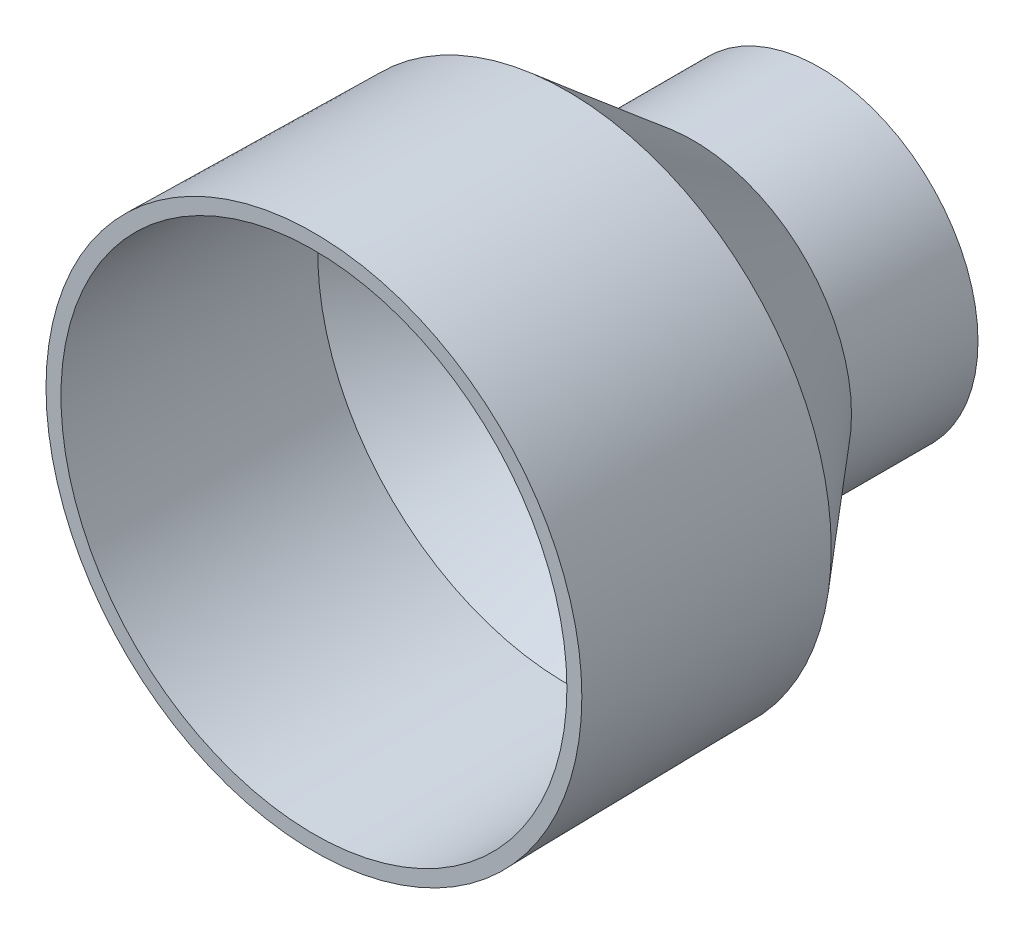
ISO-10303-21;
HEADER;
FILE_DESCRIPTION(('STEP AP214'),'2;1');
FILE_NAME('part.step','',(''),(''),'','','');
FILE_SCHEMA(('AUTOMOTIVE_DESIGN { 1 0 10303 214 1 1 1 1 }'));
ENDSEC;
DATA;
#1=APPLICATION_CONTEXT('core data for automotive mechanical design processes');
#2=APPLICATION_PROTOCOL_DEFINITION('international standard','automotive_design',2000,#1);
#3=PRODUCT_CONTEXT('',#1,'mechanical');
#4=PRODUCT('Part','Part','',(#3));
#5=PRODUCT_RELATED_PRODUCT_CATEGORY('part','',(#4));
#6=PRODUCT_DEFINITION_FORMATION('','',#4);
#7=PRODUCT_DEFINITION_CONTEXT('part definition',#1,'design');
#8=PRODUCT_DEFINITION('design','',#6,#7);
#9=PRODUCT_DEFINITION_SHAPE('','',#8);
#10=(LENGTH_UNIT() NAMED_UNIT(*) SI_UNIT(.MILLI.,.METRE.));
#11=(NAMED_UNIT(*) PLANE_ANGLE_UNIT() SI_UNIT($,.RADIAN.));
#12=(NAMED_UNIT(*) SI_UNIT($,.STERADIAN.) SOLID_ANGLE_UNIT());
#13=UNCERTAINTY_MEASURE_WITH_UNIT(LENGTH_MEASURE(1.E-05),#10,'distance_accuracy_value','');
#14=(GEOMETRIC_REPRESENTATION_CONTEXT(3) GLOBAL_UNCERTAINTY_ASSIGNED_CONTEXT((#13)) GLOBAL_UNIT_ASSIGNED_CONTEXT((#10,
#11,#12)) REPRESENTATION_CONTEXT('',''));
#15=CARTESIAN_POINT('',(0.,0.,0.));
#16=DIRECTION('',(0.,0.,1.));
#17=DIRECTION('',(1.,0.,0.));
#18=AXIS2_PLACEMENT_3D('',#15,#16,#17);
#19=CARTESIAN_POINT('',(0.,50.8,0.));
#20=DIRECTION('',(0.,0.,-1.));
#21=DIRECTION('',(-1.,0.,0.));
#22=AXIS2_PLACEMENT_3D('',#19,#20,#21);
#23=PLANE('',#22);
#24=CARTESIAN_POINT('',(0.,0.,0.));
#25=DIRECTION('',(0.,0.,1.));
#26=DIRECTION('',(1.,0.,0.));
#27=AXIS2_PLACEMENT_3D('',#24,#25,#26);
#28=CIRCLE('',#27,50.8);
#29=CARTESIAN_POINT('',(50.8,0.,0.));
#30=VERTEX_POINT('',#29);
#31=EDGE_CURVE('E10',#30,#30,#28,.T.);
#32=ORIENTED_EDGE('',*,*,#31,.F.);
#33=EDGE_LOOP('',(#32));
#34=FACE_BOUND('',#33,.T.);
#35=CARTESIAN_POINT('',(0.,0.,0.));
#36=DIRECTION('',(0.,0.,1.));
#37=DIRECTION('',(1.,0.,0.));
#38=AXIS2_PLACEMENT_3D('',#35,#36,#37);
#39=CIRCLE('',#38,53.8003374810178);
#40=CARTESIAN_POINT('',(53.8003374810178,0.,0.));
#41=VERTEX_POINT('',#40);
#42=EDGE_CURVE('E59',#41,#41,#39,.T.);
#43=ORIENTED_EDGE('',*,*,#42,.T.);
#44=EDGE_LOOP('',(#43));
#45=FACE_BOUND('',#44,.T.);
#46=ADVANCED_FACE('F31',(#34,#45),#23,.F.);
#47=CARTESIAN_POINT('',(0.,0.,0.));
#48=DIRECTION('',(0.,0.,1.));
#49=DIRECTION('',(1.,0.,0.));
#50=AXIS2_PLACEMENT_3D('',#47,#48,#49);
#51=CONICAL_SURFACE('',#50,50.8,0.0149988751518506);
#52=CARTESIAN_POINT('',(0.,0.,-50.8));
#53=DIRECTION('',(0.,0.,1.));
#54=DIRECTION('',(1.,0.,0.));
#55=AXIS2_PLACEMENT_3D('',#52,#53,#54);
#56=CIRCLE('',#55,50.038);
#57=CARTESIAN_POINT('',(50.038,0.,-50.8));
#58=VERTEX_POINT('',#57);
#59=EDGE_CURVE('E37',#58,#58,#56,.T.);
#60=ORIENTED_EDGE('',*,*,#59,.F.);
#61=EDGE_LOOP('',(#60));
#62=FACE_BOUND('',#61,.T.);
#63=ORIENTED_EDGE('',*,*,#31,.T.);
#64=EDGE_LOOP('',(#63));
#65=FACE_BOUND('',#64,.T.);
#66=ADVANCED_FACE('F96',(#62,#65),#51,.F.);
#67=CARTESIAN_POINT('',(0.,0.,-50.8));
#68=DIRECTION('',(0.,0.,1.));
#69=DIRECTION('',(1.,0.,0.));
#70=AXIS2_PLACEMENT_3D('',#67,#68,#69);
#71=CONICAL_SURFACE('',#70,50.038,0.701584135019358);
#72=CARTESIAN_POINT('',(0.,0.,-76.2));
#73=DIRECTION('',(0.,0.,1.));
#74=DIRECTION('',(1.,0.,0.));
#75=AXIS2_PLACEMENT_3D('',#72,#73,#74);
#76=CIRCLE('',#75,28.575);
#77=CARTESIAN_POINT('',(28.575,0.,-76.2));
#78=VERTEX_POINT('',#77);
#79=EDGE_CURVE('E41',#78,#78,#76,.T.);
#80=ORIENTED_EDGE('',*,*,#79,.F.);
#81=EDGE_LOOP('',(#80));
#82=FACE_BOUND('',#81,.T.);
#83=ORIENTED_EDGE('',*,*,#59,.T.);
#84=EDGE_LOOP('',(#83));
#85=FACE_BOUND('',#84,.T.);
#86=ADVANCED_FACE('F91',(#82,#85),#71,.F.);
#87=CARTESIAN_POINT('',(0.,0.,0.));
#88=DIRECTION('',(0.,0.,1.));
#89=DIRECTION('',(1.,0.,0.));
#90=AXIS2_PLACEMENT_3D('',#87,#88,#89);
#91=CYLINDRICAL_SURFACE('',#90,28.575);
#92=CARTESIAN_POINT('',(0.,0.,-101.6));
#93=DIRECTION('',(0.,0.,1.));
#94=DIRECTION('',(1.,0.,0.));
#95=AXIS2_PLACEMENT_3D('',#92,#93,#94);
#96=CIRCLE('',#95,28.575);
#97=CARTESIAN_POINT('',(28.575,0.,-101.6));
#98=VERTEX_POINT('',#97);
#99=EDGE_CURVE('E45',#98,#98,#96,.T.);
#100=ORIENTED_EDGE('',*,*,#99,.F.);
#101=EDGE_LOOP('',(#100));
#102=FACE_BOUND('',#101,.T.);
#103=ORIENTED_EDGE('',*,*,#79,.T.);
#104=EDGE_LOOP('',(#103));
#105=FACE_BOUND('',#104,.T.);
#106=ADVANCED_FACE('F85',(#102,#105),#91,.F.);
#107=CARTESIAN_POINT('',(0.,31.75,-101.6));
#108=DIRECTION('',(0.,0.,1.));
#109=DIRECTION('',(1.,0.,0.));
#110=AXIS2_PLACEMENT_3D('',#107,#108,#109);
#111=PLANE('',#110);
#112=CARTESIAN_POINT('',(0.,0.,-101.6));
#113=DIRECTION('',(0.,0.,1.));
#114=DIRECTION('',(1.,0.,0.));
#115=AXIS2_PLACEMENT_3D('',#112,#113,#114);
#116=CIRCLE('',#115,31.75);
#117=CARTESIAN_POINT('',(31.75,0.,-101.6));
#118=VERTEX_POINT('',#117);
#119=EDGE_CURVE('E50',#118,#118,#116,.T.);
#120=ORIENTED_EDGE('',*,*,#119,.F.);
#121=EDGE_LOOP('',(#120));
#122=FACE_BOUND('',#121,.T.);
#123=ORIENTED_EDGE('',*,*,#99,.T.);
#124=EDGE_LOOP('',(#123));
#125=FACE_BOUND('',#124,.T.);
#126=ADVANCED_FACE('F79',(#122,#125),#111,.F.);
#127=CARTESIAN_POINT('',(0.,0.,0.));
#128=DIRECTION('',(0.,0.,1.));
#129=DIRECTION('',(1.,0.,0.));
#130=AXIS2_PLACEMENT_3D('',#127,#128,#129);
#131=CYLINDRICAL_SURFACE('',#130,31.75);
#132=CARTESIAN_POINT('',(0.,0.,-76.2));
#133=DIRECTION('',(0.,0.,1.));
#134=DIRECTION('',(1.,0.,0.));
#135=AXIS2_PLACEMENT_3D('',#132,#133,#134);
#136=CIRCLE('',#135,31.75);
#137=CARTESIAN_POINT('',(31.75,0.,-76.2));
#138=VERTEX_POINT('',#137);
#139=EDGE_CURVE('E53',#138,#138,#136,.T.);
#140=ORIENTED_EDGE('',*,*,#139,.F.);
#141=EDGE_LOOP('',(#140));
#142=FACE_BOUND('',#141,.T.);
#143=ORIENTED_EDGE('',*,*,#119,.T.);
#144=EDGE_LOOP('',(#143));
#145=FACE_BOUND('',#144,.T.);
#146=ADVANCED_FACE('F73',(#142,#145),#131,.T.);
#147=CARTESIAN_POINT('',(0.,0.,-76.2));
#148=DIRECTION('',(0.,0.,1.));
#149=DIRECTION('',(1.,0.,0.));
#150=AXIS2_PLACEMENT_3D('',#147,#148,#149);
#151=CONICAL_SURFACE('',#150,31.75,0.698416010811808);
#152=CARTESIAN_POINT('',(0.,0.,-50.8449949383541));
#153=DIRECTION('',(0.,0.,1.));
#154=DIRECTION('',(1.,0.,0.));
#155=AXIS2_PLACEMENT_3D('',#152,#153,#154);
#156=CIRCLE('',#155,53.0376625569424);
#157=CARTESIAN_POINT('',(53.0376625569424,0.,-50.8449949383541));
#158=VERTEX_POINT('',#157);
#159=EDGE_CURVE('E56',#158,#158,#156,.T.);
#160=ORIENTED_EDGE('',*,*,#159,.F.);
#161=EDGE_LOOP('',(#160));
#162=FACE_BOUND('',#161,.T.);
#163=ORIENTED_EDGE('',*,*,#139,.T.);
#164=EDGE_LOOP('',(#163));
#165=FACE_BOUND('',#164,.T.);
#166=ADVANCED_FACE('F67',(#162,#165),#151,.T.);
#167=CARTESIAN_POINT('',(0.,0.,-0.0449949383541297));
#168=DIRECTION('',(0.,0.,1.));
#169=DIRECTION('',(1.,0.,0.));
#170=AXIS2_PLACEMENT_3D('',#167,#168,#169);
#171=CONICAL_SURFACE('',#170,53.7996625569424,0.0149988751519265);
#172=ORIENTED_EDGE('',*,*,#42,.F.);
#173=EDGE_LOOP('',(#172));
#174=FACE_BOUND('',#173,.T.);
#175=ORIENTED_EDGE('',*,*,#159,.T.);
#176=EDGE_LOOP('',(#175));
#177=FACE_BOUND('',#176,.T.);
#178=ADVANCED_FACE('F64',(#174,#177),#171,.T.);
#179=CLOSED_SHELL('',(#46,#66,#86,#106,#126,#146,#166,#178));
#180=MANIFOLD_SOLID_BREP('B2',#179);
#181=ADVANCED_BREP_SHAPE_REPRESENTATION('',(#18,#180),#14);
#182=SHAPE_DEFINITION_REPRESENTATION(#9,#181);
ENDSEC;
END-ISO-10303-21;
